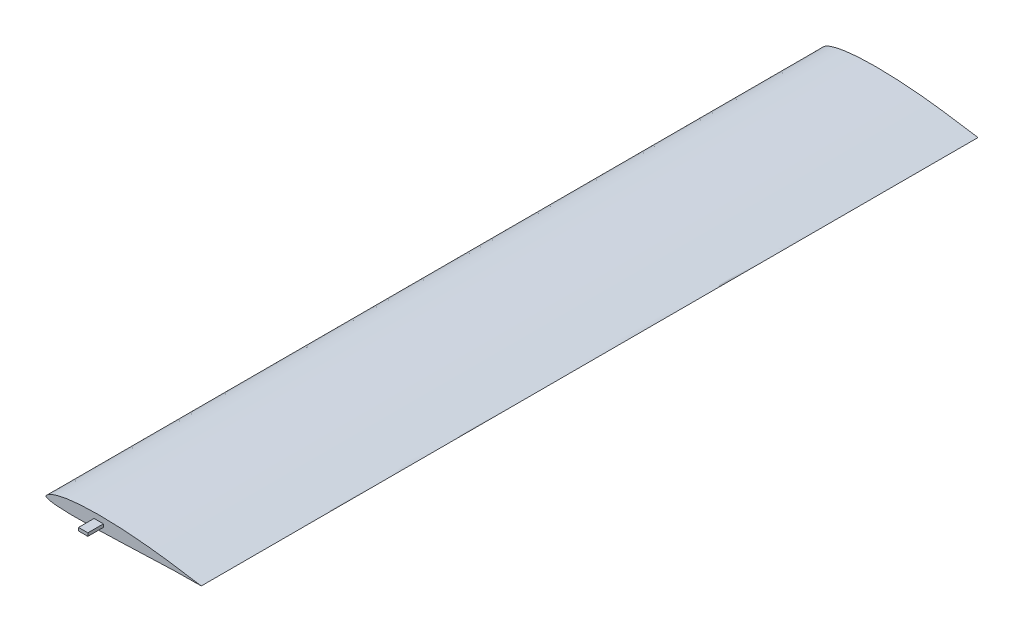
ISO-10303-21;
HEADER;
FILE_DESCRIPTION(('STEP AP214'),'2;1');
FILE_NAME('part.step','',(''),(''),'','','');
FILE_SCHEMA(('AUTOMOTIVE_DESIGN { 1 0 10303 214 1 1 1 1 }'));
ENDSEC;
DATA;
#1=APPLICATION_CONTEXT('core data for automotive mechanical design processes');
#2=APPLICATION_PROTOCOL_DEFINITION('international standard','automotive_design',2000,#1);
#3=PRODUCT_CONTEXT('',#1,'mechanical');
#4=PRODUCT('Part','Part','',(#3));
#5=PRODUCT_RELATED_PRODUCT_CATEGORY('part','',(#4));
#6=PRODUCT_DEFINITION_FORMATION('','',#4);
#7=PRODUCT_DEFINITION_CONTEXT('part definition',#1,'design');
#8=PRODUCT_DEFINITION('design','',#6,#7);
#9=PRODUCT_DEFINITION_SHAPE('','',#8);
#10=(LENGTH_UNIT() NAMED_UNIT(*) SI_UNIT(.MILLI.,.METRE.));
#11=(NAMED_UNIT(*) PLANE_ANGLE_UNIT() SI_UNIT($,.RADIAN.));
#12=(NAMED_UNIT(*) SI_UNIT($,.STERADIAN.) SOLID_ANGLE_UNIT());
#13=UNCERTAINTY_MEASURE_WITH_UNIT(LENGTH_MEASURE(1.E-05),#10,'distance_accuracy_value','');
#14=(GEOMETRIC_REPRESENTATION_CONTEXT(3) GLOBAL_UNCERTAINTY_ASSIGNED_CONTEXT((#13)) GLOBAL_UNIT_ASSIGNED_CONTEXT((#10,
#11,#12)) REPRESENTATION_CONTEXT('',''));
#15=CARTESIAN_POINT('',(0.,0.,0.));
#16=DIRECTION('',(0.,0.,1.));
#17=DIRECTION('',(1.,0.,0.));
#18=AXIS2_PLACEMENT_3D('',#15,#16,#17);
#19=CARTESIAN_POINT('',(0.152421900745486,0.326070947575085,250.));
#20=DIRECTION('',(0.,0.,-1.));
#21=DIRECTION('',(-1.,0.,0.));
#22=AXIS2_PLACEMENT_3D('',#19,#20,#21);
#23=PLANE('',#22);
#24=CARTESIAN_POINT('',(50.,0.,250.));
#25=CARTESIAN_POINT('',(50.0001273205321,0.00242279201757395,250.));
#26=CARTESIAN_POINT('',(49.6521840088656,0.0329586213581371,250.));
#27=CARTESIAN_POINT('',(49.3010972078679,0.0831885092802938,250.));
#28=CARTESIAN_POINT('',(48.4592740042575,0.194453497250842,250.));
#29=CARTESIAN_POINT('',(47.4414796455049,0.349875411204893,250.));
#30=CARTESIAN_POINT('',(46.1337766076312,0.554864153763786,250.));
#31=CARTESIAN_POINT('',(44.61548504643,0.799310741550212,250.));
#32=CARTESIAN_POINT('',(42.892312753215,1.07508556042278,250.));
#33=CARTESIAN_POINT('',(40.9957541480389,1.37098043133005,250.));
#34=CARTESIAN_POINT('',(38.9477175297238,1.67466948244018,250.));
#35=CARTESIAN_POINT('',(36.7703229553684,1.97111561609218,250.));
#36=CARTESIAN_POINT('',(34.4838392458463,2.24976134532858,250.));
#37=CARTESIAN_POINT('',(32.1089909863567,2.50484012757015,250.));
#38=CARTESIAN_POINT('',(29.6686085801485,2.73223984273263,250.));
#39=CARTESIAN_POINT('',(27.1889211643221,2.93178234235765,250.));
#40=CARTESIAN_POINT('',(24.6971414763768,3.09962286666098,250.));
#41=CARTESIAN_POINT('',(22.2188171394647,3.22515516799604,250.));
#42=CARTESIAN_POINT('',(19.7784476370654,3.30480069516153,250.));
#43=CARTESIAN_POINT('',(17.399570259008,3.33876730413773,250.));
#44=CARTESIAN_POINT('',(15.1043181791753,3.3209608777707,250.));
#45=CARTESIAN_POINT('',(12.9137731066449,3.24922988713664,250.));
#46=CARTESIAN_POINT('',(10.8475464138471,3.12961914842588,250.));
#47=CARTESIAN_POINT('',(8.92450970637668,2.95957732669919,250.));
#48=CARTESIAN_POINT('',(7.16128784341364,2.74042886608446,250.));
#49=CARTESIAN_POINT('',(5.57151750585493,2.47671453354688,250.));
#50=CARTESIAN_POINT('',(4.16707882987432,2.17390075017167,250.));
#51=CARTESIAN_POINT('',(2.95762695169971,1.83762559037907,250.));
#52=CARTESIAN_POINT('',(1.95046514173136,1.47726345244253,250.));
#53=CARTESIAN_POINT('',(1.1488164731194,1.10304578750434,250.));
#54=CARTESIAN_POINT('',(0.558729346152352,0.731078994339724,250.));
#55=CARTESIAN_POINT('',(0.228075960717646,0.436603357022112,250.));
#56=CARTESIAN_POINT('',(0.0899921707710676,0.239435058265833,250.));
#57=CARTESIAN_POINT('',(0.0408145747667068,0.152213956619051,250.));
#58=CARTESIAN_POINT('',(0.0104498427942053,0.0738270967810475,250.));
#59=CARTESIAN_POINT('',(-0.00154321203104168,0.0120299064321601,250.));
#60=CARTESIAN_POINT('',(0.000871812243820358,-0.0366659130874011,250.));
#61=CARTESIAN_POINT('',(0.024720092378635,-0.0803785419457888,250.));
#62=CARTESIAN_POINT('',(0.0694179091201762,-0.130458815267373,250.));
#63=CARTESIAN_POINT('',(0.14105047094681,-0.188547481064558,250.));
#64=CARTESIAN_POINT('',(0.314418627664273,-0.296228741008699,250.));
#65=CARTESIAN_POINT('',(0.700511343454124,-0.453609622775309,250.));
#66=CARTESIAN_POINT('',(1.37809381395956,-0.628171653606636,250.));
#67=CARTESIAN_POINT('',(2.33745724684421,-0.787734756121067,250.));
#68=CARTESIAN_POINT('',(3.53896744786107,-0.918209354920351,250.));
#69=CARTESIAN_POINT('',(4.97416794497812,-1.01541081628356,250.));
#70=CARTESIAN_POINT('',(6.63120920300308,-1.0793435198751,250.));
#71=CARTESIAN_POINT('',(8.49561044435645,-1.11065446399736,250.));
#72=CARTESIAN_POINT('',(10.5496690235186,-1.11199123142911,250.));
#73=CARTESIAN_POINT('',(12.7727629501113,-1.08678554760908,250.));
#74=CARTESIAN_POINT('',(15.1414405609385,-1.038931401911,250.));
#75=CARTESIAN_POINT('',(17.6298490171543,-0.972256842199377,250.));
#76=CARTESIAN_POINT('',(20.2103380011535,-0.89056470943051,250.));
#77=CARTESIAN_POINT('',(22.8538200474147,-0.797649565655998,250.));
#78=CARTESIAN_POINT('',(25.5302884922338,-0.696923220419977,250.));
#79=CARTESIAN_POINT('',(28.2090611101534,-0.592479052656274,250.));
#80=CARTESIAN_POINT('',(30.8590409643815,-0.487645246314674,250.));
#81=CARTESIAN_POINT('',(33.4489998510024,-0.386619732218495,250.));
#82=CARTESIAN_POINT('',(35.9478419458797,-0.29237673432343,250.));
#83=CARTESIAN_POINT('',(38.3250166377282,-0.208048772804269,250.));
#84=CARTESIAN_POINT('',(40.5510042661914,-0.135849855230422,250.));
#85=CARTESIAN_POINT('',(42.5963952436551,-0.0784780186568451,250.));
#86=CARTESIAN_POINT('',(44.436055181628,-0.0364613008818633,250.));
#87=CARTESIAN_POINT('',(46.0377523753407,-0.00914858105455184,250.));
#88=CARTESIAN_POINT('',(47.3989816954244,0.00431028092650521,250.));
#89=CARTESIAN_POINT('',(48.4440543669687,0.00956179029864694,250.));
#90=CARTESIAN_POINT('',(49.2972475070281,0.00421127418794704,250.));
#91=CARTESIAN_POINT('',(49.6515010884607,0.00898210223244359,250.));
#92=CARTESIAN_POINT('',(49.9998725644973,-0.0024249798023086,250.));
#93=CARTESIAN_POINT('',(50.,0.,250.));
#94=B_SPLINE_CURVE_WITH_KNOTS('',3,(#24,#25,#26,#27,#28,#29,#30,#31,#32,#33,#34,#35,#36,#37,#38,
#39,#40,#41,#42,#43,#44,#45,#46,#47,#48,#49,#50,#51,#52,#53,#54,#55,#56,#57,#58,#59,#60,#61,#62,
#63,#64,#65,#66,#67,#68,#69,#70,#71,#72,#73,#74,#75,#76,#77,#78,#79,#80,#81,#82,#83,#84,#85,#86,
#87,#88,#89,#90,#91,#92,#93),.UNSPECIFIED.,.T.,.F.,(4,1,1,1,1,1,1,1,1,1,1,1,1,1,1,1,1,1,1,1,1,1,
1,1,1,1,1,1,1,1,1,1,1,1,1,1,1,1,1,1,1,1,1,1,1,1,1,1,1,1,1,1,1,1,1,1,1,1,1,1,1,1,1,1,1,1,1,4),
(0.,0.00163100967529279,0.006435235004734,0.0142206692223634,0.0247656252579182,
0.0378267269580913,0.0531493478862453,0.0704735042826113,0.0895356944216796,0.110075427516268,
0.131859874985406,0.154692567294311,0.178371256169875,0.202679511873491,0.22736396068896,
0.252132687183434,0.276728350590027,0.300939435147841,0.324527110506369,0.347267376957691,
0.368991726016915,0.389507470720742,0.408628379551237,0.426224009291417,0.442178727529928,
0.456395551168158,0.4688051239249,0.479372317511659,0.488085518085538,0.494967923813924,
0.500033810265933,0.501035662602399,0.502094489523219,0.502996978480934,0.503512880218242,
0.503955825590444,0.504408894464655,0.504955422997044,0.50594262600694,0.507129613737027,
0.510997734788642,0.518231918904382,0.52784553190147,0.539808758125613,0.554055914736768,
0.570489591502225,0.588973674400973,0.609342058034304,0.631392896979107,0.654894033520888,
0.679589724771299,0.705203145434866,0.731446603653204,0.758020282196595,0.784619627763923,
0.81093562404957,0.836656652810421,0.861473352283136,0.885081474957591,0.90718794410531,
0.927507338219275,0.945765257215092,0.961711873943494,0.975121793215094,0.985796265959578,
0.993581185210361,0.998367517520586,1.),.UNSPECIFIED.);
#95=CARTESIAN_POINT('',(50.,0.,250.));
#96=VERTEX_POINT('',#95);
#97=EDGE_CURVE('E11',#96,#96,#94,.T.);
#98=ORIENTED_EDGE('',*,*,#97,.T.);
#99=EDGE_LOOP('',(#98));
#100=FACE_BOUND('',#99,.T.);
#101=DIRECTION('',(0.,-1.,0.));
#102=VECTOR('',#101,1.);
#103=CARTESIAN_POINT('',(15.473,1.54937101438664,250.));
#104=LINE('',#103,#102);
#105=CARTESIAN_POINT('',(15.473,1.54937101438664,250.));
#106=VERTEX_POINT('',#105);
#107=CARTESIAN_POINT('',(15.473,0.549371014386642,250.));
#108=VERTEX_POINT('',#107);
#109=EDGE_CURVE('E101',#106,#108,#104,.T.);
#110=ORIENTED_EDGE('',*,*,#109,.F.);
#111=DIRECTION('',(-1.,0.,0.));
#112=VECTOR('',#111,1.);
#113=CARTESIAN_POINT('',(15.473,1.54937101438664,250.));
#114=LINE('',#113,#112);
#115=CARTESIAN_POINT('',(18.473,1.54937101438664,250.));
#116=VERTEX_POINT('',#115);
#117=EDGE_CURVE('E98',#116,#106,#114,.T.);
#118=ORIENTED_EDGE('',*,*,#117,.F.);
#119=DIRECTION('',(0.,1.,0.));
#120=VECTOR('',#119,1.);
#121=CARTESIAN_POINT('',(18.473,1.54937101438664,250.));
#122=LINE('',#121,#120);
#123=CARTESIAN_POINT('',(18.473,0.549371014386642,250.));
#124=VERTEX_POINT('',#123);
#125=EDGE_CURVE('E60',#124,#116,#122,.T.);
#126=ORIENTED_EDGE('',*,*,#125,.F.);
#127=DIRECTION('',(1.,0.,0.));
#128=VECTOR('',#127,1.);
#129=CARTESIAN_POINT('',(15.473,0.549371014386642,250.));
#130=LINE('',#129,#128);
#131=EDGE_CURVE('E55',#108,#124,#130,.T.);
#132=ORIENTED_EDGE('',*,*,#131,.F.);
#133=EDGE_LOOP('',(#110,#118,#126,#132));
#134=FACE_BOUND('',#133,.T.);
#135=ADVANCED_FACE('F38',(#100,#134),#23,.F.);
#136=DIRECTION('',(0.,0.,-1.));
#137=VECTOR('',#136,1.);
#138=SURFACE_OF_LINEAR_EXTRUSION('',#94,#137);
#139=ORIENTED_EDGE('',*,*,#97,.F.);
#140=EDGE_LOOP('',(#139));
#141=FACE_BOUND('',#140,.T.);
#142=CARTESIAN_POINT('',(50.,0.,0.));
#143=CARTESIAN_POINT('',(50.0001273205321,0.00242279201757395,0.));
#144=CARTESIAN_POINT('',(49.6521840088656,0.0329586213581371,0.));
#145=CARTESIAN_POINT('',(49.3010972078679,0.0831885092802938,0.));
#146=CARTESIAN_POINT('',(48.4592740042575,0.194453497250842,0.));
#147=CARTESIAN_POINT('',(47.4414796455049,0.349875411204893,0.));
#148=CARTESIAN_POINT('',(46.1337766076312,0.554864153763786,0.));
#149=CARTESIAN_POINT('',(44.61548504643,0.799310741550212,0.));
#150=CARTESIAN_POINT('',(42.892312753215,1.07508556042278,0.));
#151=CARTESIAN_POINT('',(40.9957541480389,1.37098043133005,0.));
#152=CARTESIAN_POINT('',(38.9477175297238,1.67466948244018,0.));
#153=CARTESIAN_POINT('',(36.7703229553684,1.97111561609218,0.));
#154=CARTESIAN_POINT('',(34.4838392458463,2.24976134532858,0.));
#155=CARTESIAN_POINT('',(32.1089909863567,2.50484012757015,0.));
#156=CARTESIAN_POINT('',(29.6686085801485,2.73223984273263,0.));
#157=CARTESIAN_POINT('',(27.1889211643221,2.93178234235765,0.));
#158=CARTESIAN_POINT('',(24.6971414763768,3.09962286666098,0.));
#159=CARTESIAN_POINT('',(22.2188171394647,3.22515516799604,0.));
#160=CARTESIAN_POINT('',(19.7784476370654,3.30480069516153,0.));
#161=CARTESIAN_POINT('',(17.399570259008,3.33876730413773,0.));
#162=CARTESIAN_POINT('',(15.1043181791753,3.3209608777707,0.));
#163=CARTESIAN_POINT('',(12.9137731066449,3.24922988713664,0.));
#164=CARTESIAN_POINT('',(10.8475464138471,3.12961914842588,0.));
#165=CARTESIAN_POINT('',(8.92450970637668,2.95957732669919,0.));
#166=CARTESIAN_POINT('',(7.16128784341364,2.74042886608446,0.));
#167=CARTESIAN_POINT('',(5.57151750585493,2.47671453354688,0.));
#168=CARTESIAN_POINT('',(4.16707882987432,2.17390075017167,0.));
#169=CARTESIAN_POINT('',(2.95762695169971,1.83762559037907,0.));
#170=CARTESIAN_POINT('',(1.95046514173136,1.47726345244253,0.));
#171=CARTESIAN_POINT('',(1.1488164731194,1.10304578750434,0.));
#172=CARTESIAN_POINT('',(0.558729346152352,0.731078994339724,0.));
#173=CARTESIAN_POINT('',(0.228075960717646,0.436603357022112,0.));
#174=CARTESIAN_POINT('',(0.0899921707710676,0.239435058265833,0.));
#175=CARTESIAN_POINT('',(0.0408145747667068,0.152213956619051,0.));
#176=CARTESIAN_POINT('',(0.0104498427942053,0.0738270967810475,0.));
#177=CARTESIAN_POINT('',(-0.00154321203104168,0.0120299064321601,0.));
#178=CARTESIAN_POINT('',(0.000871812243820358,-0.0366659130874011,0.));
#179=CARTESIAN_POINT('',(0.024720092378635,-0.0803785419457888,0.));
#180=CARTESIAN_POINT('',(0.0694179091201762,-0.130458815267373,0.));
#181=CARTESIAN_POINT('',(0.14105047094681,-0.188547481064558,0.));
#182=CARTESIAN_POINT('',(0.314418627664273,-0.296228741008699,0.));
#183=CARTESIAN_POINT('',(0.700511343454124,-0.453609622775309,0.));
#184=CARTESIAN_POINT('',(1.37809381395956,-0.628171653606636,0.));
#185=CARTESIAN_POINT('',(2.33745724684421,-0.787734756121067,0.));
#186=CARTESIAN_POINT('',(3.53896744786107,-0.918209354920351,0.));
#187=CARTESIAN_POINT('',(4.97416794497812,-1.01541081628356,0.));
#188=CARTESIAN_POINT('',(6.63120920300308,-1.0793435198751,0.));
#189=CARTESIAN_POINT('',(8.49561044435645,-1.11065446399736,0.));
#190=CARTESIAN_POINT('',(10.5496690235186,-1.11199123142911,0.));
#191=CARTESIAN_POINT('',(12.7727629501113,-1.08678554760908,0.));
#192=CARTESIAN_POINT('',(15.1414405609385,-1.038931401911,0.));
#193=CARTESIAN_POINT('',(17.6298490171543,-0.972256842199377,0.));
#194=CARTESIAN_POINT('',(20.2103380011535,-0.89056470943051,0.));
#195=CARTESIAN_POINT('',(22.8538200474147,-0.797649565655998,0.));
#196=CARTESIAN_POINT('',(25.5302884922338,-0.696923220419977,0.));
#197=CARTESIAN_POINT('',(28.2090611101534,-0.592479052656274,0.));
#198=CARTESIAN_POINT('',(30.8590409643815,-0.487645246314674,0.));
#199=CARTESIAN_POINT('',(33.4489998510024,-0.386619732218495,0.));
#200=CARTESIAN_POINT('',(35.9478419458797,-0.29237673432343,0.));
#201=CARTESIAN_POINT('',(38.3250166377282,-0.208048772804269,0.));
#202=CARTESIAN_POINT('',(40.5510042661914,-0.135849855230422,0.));
#203=CARTESIAN_POINT('',(42.5963952436551,-0.0784780186568451,0.));
#204=CARTESIAN_POINT('',(44.436055181628,-0.0364613008818633,0.));
#205=CARTESIAN_POINT('',(46.0377523753407,-0.00914858105455184,0.));
#206=CARTESIAN_POINT('',(47.3989816954244,0.00431028092650521,0.));
#207=CARTESIAN_POINT('',(48.4440543669687,0.00956179029864694,0.));
#208=CARTESIAN_POINT('',(49.2972475070281,0.00421127418794704,0.));
#209=CARTESIAN_POINT('',(49.6515010884607,0.00898210223244359,0.));
#210=CARTESIAN_POINT('',(49.9998725644973,-0.0024249798023086,0.));
#211=CARTESIAN_POINT('',(50.,0.,0.));
#212=B_SPLINE_CURVE_WITH_KNOTS('',3,(#142,#143,#144,#145,#146,#147,#148,#149,#150,#151,#152,
#153,#154,#155,#156,#157,#158,#159,#160,#161,#162,#163,#164,#165,#166,#167,#168,#169,#170,#171,
#172,#173,#174,#175,#176,#177,#178,#179,#180,#181,#182,#183,#184,#185,#186,#187,#188,#189,#190,
#191,#192,#193,#194,#195,#196,#197,#198,#199,#200,#201,#202,#203,#204,#205,#206,#207,#208,#209,
#210,#211),.UNSPECIFIED.,.T.,.F.,(4,1,1,1,1,1,1,1,1,1,1,1,1,1,1,1,1,1,1,1,1,1,1,1,1,1,1,1,1,1,1,
1,1,1,1,1,1,1,1,1,1,1,1,1,1,1,1,1,1,1,1,1,1,1,1,1,1,1,1,1,1,1,1,1,1,1,1,4),(0.,
0.00163100967529279,0.006435235004734,0.0142206692223634,0.0247656252579182,0.0378267269580913,
0.0531493478862453,0.0704735042826113,0.0895356944216796,0.110075427516268,0.131859874985406,
0.154692567294311,0.178371256169875,0.202679511873491,0.22736396068896,0.252132687183434,
0.276728350590027,0.300939435147841,0.324527110506369,0.347267376957691,0.368991726016915,
0.389507470720742,0.408628379551237,0.426224009291417,0.442178727529928,0.456395551168158,
0.4688051239249,0.479372317511659,0.488085518085538,0.494967923813924,0.500033810265933,
0.501035662602399,0.502094489523219,0.502996978480934,0.503512880218242,0.503955825590444,
0.504408894464655,0.504955422997044,0.50594262600694,0.507129613737027,0.510997734788642,
0.518231918904382,0.52784553190147,0.539808758125613,0.554055914736768,0.570489591502225,
0.588973674400973,0.609342058034304,0.631392896979107,0.654894033520888,0.679589724771299,
0.705203145434866,0.731446603653204,0.758020282196595,0.784619627763923,0.81093562404957,
0.836656652810421,0.861473352283136,0.885081474957591,0.90718794410531,0.927507338219275,
0.945765257215092,0.961711873943494,0.975121793215094,0.985796265959578,0.993581185210361,
0.998367517520586,1.),.UNSPECIFIED.);
#213=CARTESIAN_POINT('',(50.,0.,0.));
#214=VERTEX_POINT('',#213);
#215=EDGE_CURVE('E43',#214,#214,#212,.T.);
#216=ORIENTED_EDGE('',*,*,#215,.T.);
#217=EDGE_LOOP('',(#216));
#218=FACE_BOUND('',#217,.T.);
#219=ADVANCED_FACE('F40',(#141,#218),#138,.F.);
#220=CARTESIAN_POINT('',(0.152421900745486,0.326070947575085,0.));
#221=DIRECTION('',(0.,0.,-1.));
#222=DIRECTION('',(-1.,0.,0.));
#223=AXIS2_PLACEMENT_3D('',#220,#221,#222);
#224=PLANE('',#223);
#225=ORIENTED_EDGE('',*,*,#215,.F.);
#226=EDGE_LOOP('',(#225));
#227=FACE_BOUND('',#226,.T.);
#228=ADVANCED_FACE('F136',(#227),#224,.T.);
#229=CARTESIAN_POINT('',(15.473,1.54937101438664,255.));
#230=DIRECTION('',(1.,0.,0.));
#231=DIRECTION('',(0.,0.,-1.));
#232=AXIS2_PLACEMENT_3D('',#229,#230,#231);
#233=PLANE('',#232);
#234=ORIENTED_EDGE('',*,*,#109,.T.);
#235=DIRECTION('',(0.,0.,-1.));
#236=VECTOR('',#235,1.);
#237=CARTESIAN_POINT('',(15.473,0.549371014386642,255.));
#238=LINE('',#237,#236);
#239=CARTESIAN_POINT('',(15.473,0.549371014386642,255.));
#240=VERTEX_POINT('',#239);
#241=EDGE_CURVE('E82',#240,#108,#238,.T.);
#242=ORIENTED_EDGE('',*,*,#241,.F.);
#243=DIRECTION('',(0.,-1.,0.));
#244=VECTOR('',#243,1.);
#245=CARTESIAN_POINT('',(15.473,1.54937101438664,255.));
#246=LINE('',#245,#244);
#247=CARTESIAN_POINT('',(15.473,1.54937101438664,255.));
#248=VERTEX_POINT('',#247);
#249=EDGE_CURVE('E89',#248,#240,#246,.T.);
#250=ORIENTED_EDGE('',*,*,#249,.F.);
#251=DIRECTION('',(0.,0.,-1.));
#252=VECTOR('',#251,1.);
#253=CARTESIAN_POINT('',(15.473,1.54937101438664,255.));
#254=LINE('',#253,#252);
#255=EDGE_CURVE('E115',#248,#106,#254,.T.);
#256=ORIENTED_EDGE('',*,*,#255,.T.);
#257=EDGE_LOOP('',(#234,#242,#250,#256));
#258=FACE_BOUND('',#257,.T.);
#259=ADVANCED_FACE('F100',(#258),#233,.F.);
#260=CARTESIAN_POINT('',(15.473,0.549371014386642,255.));
#261=DIRECTION('',(0.,1.,0.));
#262=DIRECTION('',(-1.,0.,0.));
#263=AXIS2_PLACEMENT_3D('',#260,#261,#262);
#264=PLANE('',#263);
#265=ORIENTED_EDGE('',*,*,#131,.T.);
#266=DIRECTION('',(0.,0.,-1.));
#267=VECTOR('',#266,1.);
#268=CARTESIAN_POINT('',(18.473,0.549371014386642,255.));
#269=LINE('',#268,#267);
#270=CARTESIAN_POINT('',(18.473,0.549371014386642,255.));
#271=VERTEX_POINT('',#270);
#272=EDGE_CURVE('E85',#271,#124,#269,.T.);
#273=ORIENTED_EDGE('',*,*,#272,.F.);
#274=DIRECTION('',(1.,0.,0.));
#275=VECTOR('',#274,1.);
#276=CARTESIAN_POINT('',(15.473,0.549371014386642,255.));
#277=LINE('',#276,#275);
#278=EDGE_CURVE('E78',#240,#271,#277,.T.);
#279=ORIENTED_EDGE('',*,*,#278,.F.);
#280=ORIENTED_EDGE('',*,*,#241,.T.);
#281=EDGE_LOOP('',(#265,#273,#279,#280));
#282=FACE_BOUND('',#281,.T.);
#283=ADVANCED_FACE('F80',(#282),#264,.F.);
#284=CARTESIAN_POINT('',(18.473,1.54937101438664,255.));
#285=DIRECTION('',(-1.,0.,0.));
#286=DIRECTION('',(0.,0.,1.));
#287=AXIS2_PLACEMENT_3D('',#284,#285,#286);
#288=PLANE('',#287);
#289=ORIENTED_EDGE('',*,*,#125,.T.);
#290=DIRECTION('',(0.,0.,-1.));
#291=VECTOR('',#290,1.);
#292=CARTESIAN_POINT('',(18.473,1.54937101438664,255.));
#293=LINE('',#292,#291);
#294=CARTESIAN_POINT('',(18.473,1.54937101438664,255.));
#295=VERTEX_POINT('',#294);
#296=EDGE_CURVE('E104',#295,#116,#293,.T.);
#297=ORIENTED_EDGE('',*,*,#296,.F.);
#298=DIRECTION('',(0.,1.,0.));
#299=VECTOR('',#298,1.);
#300=CARTESIAN_POINT('',(18.473,1.54937101438664,255.));
#301=LINE('',#300,#299);
#302=EDGE_CURVE('E88',#271,#295,#301,.T.);
#303=ORIENTED_EDGE('',*,*,#302,.F.);
#304=ORIENTED_EDGE('',*,*,#272,.T.);
#305=EDGE_LOOP('',(#289,#297,#303,#304));
#306=FACE_BOUND('',#305,.T.);
#307=ADVANCED_FACE('F125',(#306),#288,.F.);
#308=CARTESIAN_POINT('',(15.473,1.54937101438664,255.));
#309=DIRECTION('',(0.,-1.,0.));
#310=DIRECTION('',(0.,0.,-1.));
#311=AXIS2_PLACEMENT_3D('',#308,#309,#310);
#312=PLANE('',#311);
#313=ORIENTED_EDGE('',*,*,#117,.T.);
#314=ORIENTED_EDGE('',*,*,#255,.F.);
#315=DIRECTION('',(-1.,0.,0.));
#316=VECTOR('',#315,1.);
#317=CARTESIAN_POINT('',(15.473,1.54937101438664,255.));
#318=LINE('',#317,#316);
#319=EDGE_CURVE('E94',#295,#248,#318,.T.);
#320=ORIENTED_EDGE('',*,*,#319,.F.);
#321=ORIENTED_EDGE('',*,*,#296,.T.);
#322=EDGE_LOOP('',(#313,#314,#320,#321));
#323=FACE_BOUND('',#322,.T.);
#324=ADVANCED_FACE('F127',(#323),#312,.F.);
#325=CARTESIAN_POINT('',(0.,0.,255.));
#326=DIRECTION('',(0.,0.,1.));
#327=DIRECTION('',(1.,0.,0.));
#328=AXIS2_PLACEMENT_3D('',#325,#326,#327);
#329=PLANE('',#328);
#330=ORIENTED_EDGE('',*,*,#249,.T.);
#331=ORIENTED_EDGE('',*,*,#278,.T.);
#332=ORIENTED_EDGE('',*,*,#302,.T.);
#333=ORIENTED_EDGE('',*,*,#319,.T.);
#334=EDGE_LOOP('',(#330,#331,#332,#333));
#335=FACE_BOUND('',#334,.T.);
#336=ADVANCED_FACE('F92',(#335),#329,.T.);
#337=CLOSED_SHELL('',(#135,#219,#228,#259,#283,#307,#324,#336));
#338=MANIFOLD_SOLID_BREP('B2',#337);
#339=ADVANCED_BREP_SHAPE_REPRESENTATION('',(#18,#338),#14);
#340=SHAPE_DEFINITION_REPRESENTATION(#9,#339);
ENDSEC;
END-ISO-10303-21;
